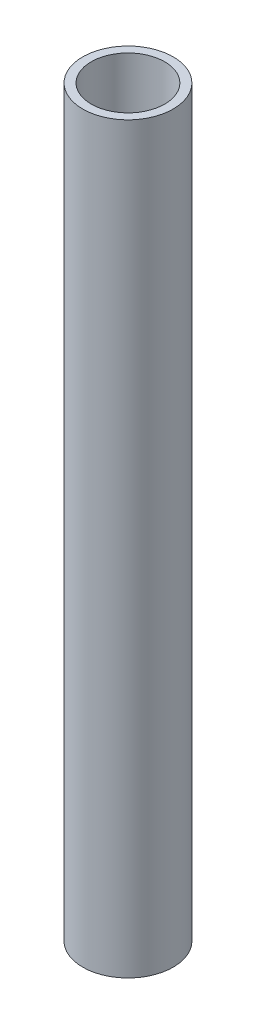
ISO-10303-21;
HEADER;
FILE_DESCRIPTION(('STEP AP214'),'2;1');
FILE_NAME('part.step','',(''),(''),'','','');
FILE_SCHEMA(('AUTOMOTIVE_DESIGN { 1 0 10303 214 1 1 1 1 }'));
ENDSEC;
DATA;
#1=APPLICATION_CONTEXT('core data for automotive mechanical design processes');
#2=APPLICATION_PROTOCOL_DEFINITION('international standard','automotive_design',2000,#1);
#3=PRODUCT_CONTEXT('',#1,'mechanical');
#4=PRODUCT('Part','Part','',(#3));
#5=PRODUCT_RELATED_PRODUCT_CATEGORY('part','',(#4));
#6=PRODUCT_DEFINITION_FORMATION('','',#4);
#7=PRODUCT_DEFINITION_CONTEXT('part definition',#1,'design');
#8=PRODUCT_DEFINITION('design','',#6,#7);
#9=PRODUCT_DEFINITION_SHAPE('','',#8);
#10=(LENGTH_UNIT() NAMED_UNIT(*) SI_UNIT(.MILLI.,.METRE.));
#11=(NAMED_UNIT(*) PLANE_ANGLE_UNIT() SI_UNIT($,.RADIAN.));
#12=(NAMED_UNIT(*) SI_UNIT($,.STERADIAN.) SOLID_ANGLE_UNIT());
#13=UNCERTAINTY_MEASURE_WITH_UNIT(LENGTH_MEASURE(1.E-05),#10,'distance_accuracy_value','');
#14=(GEOMETRIC_REPRESENTATION_CONTEXT(3) GLOBAL_UNCERTAINTY_ASSIGNED_CONTEXT((#13)) GLOBAL_UNIT_ASSIGNED_CONTEXT((#10,
#11,#12)) REPRESENTATION_CONTEXT('',''));
#15=CARTESIAN_POINT('',(0.,0.,0.));
#16=DIRECTION('',(0.,0.,1.));
#17=DIRECTION('',(1.,0.,0.));
#18=AXIS2_PLACEMENT_3D('',#15,#16,#17);
#19=CARTESIAN_POINT('',(2.45914399954472E-11,175.,1.49999999999999));
#20=DIRECTION('',(0.,1.,0.));
#21=DIRECTION('',(0.,0.,1.));
#22=AXIS2_PLACEMENT_3D('',#19,#20,#21);
#23=PLANE('',#22);
#24=CARTESIAN_POINT('',(2.45914399954472E-11,175.,1.49999999999999));
#25=DIRECTION('',(0.,1.,0.));
#26=DIRECTION('',(0.,0.,1.));
#27=AXIS2_PLACEMENT_3D('',#24,#25,#26);
#28=CIRCLE('',#27,10.65);
#29=CARTESIAN_POINT('',(2.45914399954472E-11,175.,12.15));
#30=VERTEX_POINT('',#29);
#31=EDGE_CURVE('E10',#30,#30,#28,.T.);
#32=ORIENTED_EDGE('',*,*,#31,.T.);
#33=EDGE_LOOP('',(#32));
#34=FACE_BOUND('',#33,.T.);
#35=CARTESIAN_POINT('',(2.45914399954472E-11,175.,1.49999999999999));
#36=DIRECTION('',(0.,1.,0.));
#37=DIRECTION('',(0.,0.,1.));
#38=AXIS2_PLACEMENT_3D('',#35,#36,#37);
#39=CIRCLE('',#38,8.65);
#40=CARTESIAN_POINT('',(2.45914399954472E-11,175.,10.15));
#41=VERTEX_POINT('',#40);
#42=EDGE_CURVE('E41',#41,#41,#39,.T.);
#43=ORIENTED_EDGE('',*,*,#42,.F.);
#44=EDGE_LOOP('',(#43));
#45=FACE_BOUND('',#44,.T.);
#46=ADVANCED_FACE('F30',(#34,#45),#23,.T.);
#47=CARTESIAN_POINT('',(2.45914399954472E-11,0.,1.49999999999999));
#48=DIRECTION('',(0.,1.,0.));
#49=DIRECTION('',(0.,0.,1.));
#50=AXIS2_PLACEMENT_3D('',#47,#48,#49);
#51=PLANE('',#50);
#52=CARTESIAN_POINT('',(2.45914399954472E-11,0.,1.49999999999999));
#53=DIRECTION('',(0.,1.,0.));
#54=DIRECTION('',(0.,0.,1.));
#55=AXIS2_PLACEMENT_3D('',#52,#53,#54);
#56=CIRCLE('',#55,10.65);
#57=CARTESIAN_POINT('',(2.45914399954472E-11,0.,12.15));
#58=VERTEX_POINT('',#57);
#59=EDGE_CURVE('E34',#58,#58,#56,.T.);
#60=ORIENTED_EDGE('',*,*,#59,.F.);
#61=EDGE_LOOP('',(#60));
#62=FACE_BOUND('',#61,.T.);
#63=CARTESIAN_POINT('',(2.45914399954472E-11,0.,1.49999999999999));
#64=DIRECTION('',(0.,1.,0.));
#65=DIRECTION('',(0.,0.,1.));
#66=AXIS2_PLACEMENT_3D('',#63,#64,#65);
#67=CIRCLE('',#66,8.65);
#68=CARTESIAN_POINT('',(2.45914399954472E-11,0.,10.15));
#69=VERTEX_POINT('',#68);
#70=EDGE_CURVE('E43',#69,#69,#67,.T.);
#71=ORIENTED_EDGE('',*,*,#70,.T.);
#72=EDGE_LOOP('',(#71));
#73=FACE_BOUND('',#72,.T.);
#74=ADVANCED_FACE('F53',(#62,#73),#51,.F.);
#75=CARTESIAN_POINT('',(2.45914399954472E-11,175.,1.49999999999999));
#76=DIRECTION('',(0.,-1.,0.));
#77=DIRECTION('',(0.,0.,-1.));
#78=AXIS2_PLACEMENT_3D('',#75,#76,#77);
#79=CYLINDRICAL_SURFACE('',#78,10.65);
#80=ORIENTED_EDGE('',*,*,#31,.F.);
#81=EDGE_LOOP('',(#80));
#82=FACE_BOUND('',#81,.T.);
#83=ORIENTED_EDGE('',*,*,#59,.T.);
#84=EDGE_LOOP('',(#83));
#85=FACE_BOUND('',#84,.T.);
#86=ADVANCED_FACE('F32',(#82,#85),#79,.T.);
#87=CARTESIAN_POINT('',(2.45914399954472E-11,175.,1.49999999999999));
#88=DIRECTION('',(0.,-1.,0.));
#89=DIRECTION('',(0.,0.,-1.));
#90=AXIS2_PLACEMENT_3D('',#87,#88,#89);
#91=CYLINDRICAL_SURFACE('',#90,8.65);
#92=ORIENTED_EDGE('',*,*,#42,.T.);
#93=EDGE_LOOP('',(#92));
#94=FACE_BOUND('',#93,.T.);
#95=ORIENTED_EDGE('',*,*,#70,.F.);
#96=EDGE_LOOP('',(#95));
#97=FACE_BOUND('',#96,.T.);
#98=ADVANCED_FACE('F49',(#94,#97),#91,.F.);
#99=CLOSED_SHELL('',(#46,#74,#86,#98));
#100=MANIFOLD_SOLID_BREP('B2',#99);
#101=ADVANCED_BREP_SHAPE_REPRESENTATION('',(#18,#100),#14);
#102=SHAPE_DEFINITION_REPRESENTATION(#9,#101);
ENDSEC;
END-ISO-10303-21;
